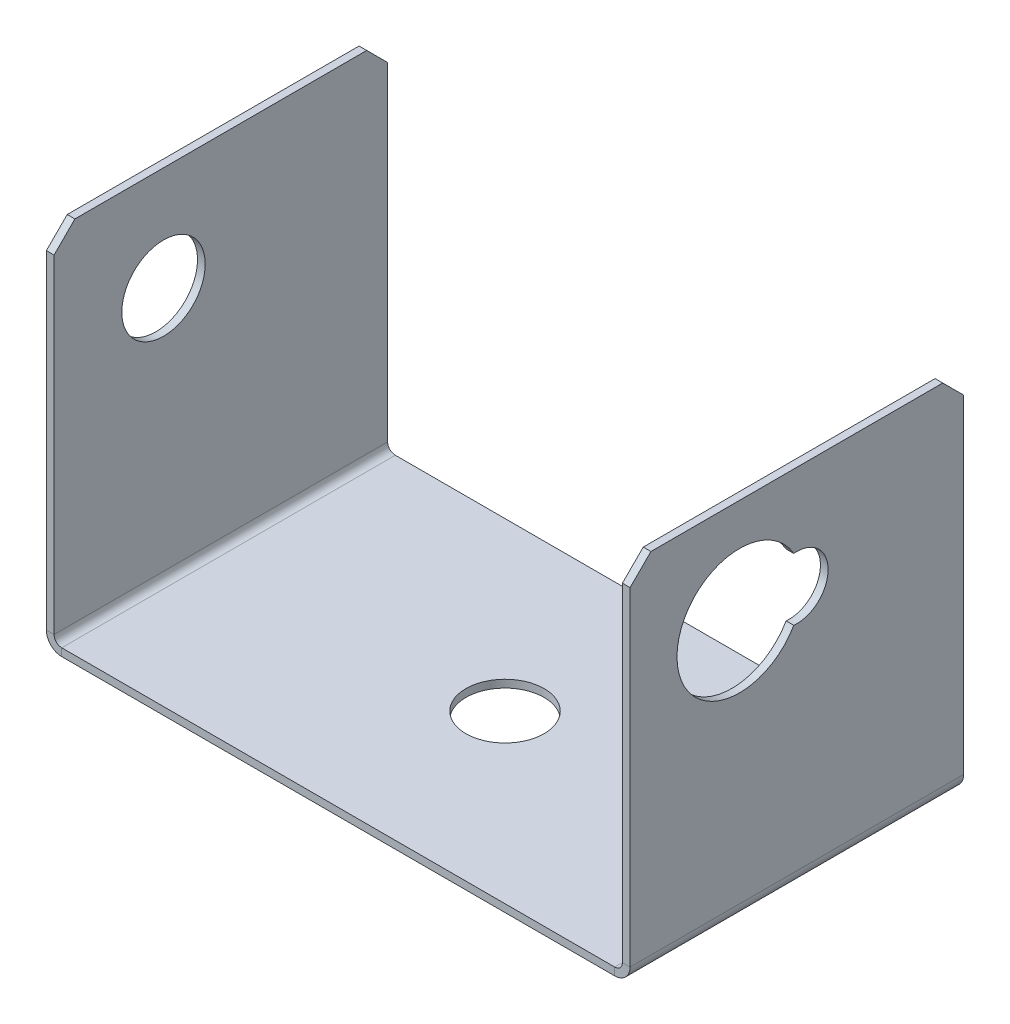
ISO-10303-21;
HEADER;
FILE_DESCRIPTION(('STEP AP214'),'2;1');
FILE_NAME('part.step','',(''),(''),'','','');
FILE_SCHEMA(('AUTOMOTIVE_DESIGN { 1 0 10303 214 1 1 1 1 }'));
ENDSEC;
DATA;
#1=APPLICATION_CONTEXT('core data for automotive mechanical design processes');
#2=APPLICATION_PROTOCOL_DEFINITION('international standard','automotive_design',2000,#1);
#3=PRODUCT_CONTEXT('',#1,'mechanical');
#4=PRODUCT('Part','Part','',(#3));
#5=PRODUCT_RELATED_PRODUCT_CATEGORY('part','',(#4));
#6=PRODUCT_DEFINITION_FORMATION('','',#4);
#7=PRODUCT_DEFINITION_CONTEXT('part definition',#1,'design');
#8=PRODUCT_DEFINITION('design','',#6,#7);
#9=PRODUCT_DEFINITION_SHAPE('','',#8);
#10=(LENGTH_UNIT() NAMED_UNIT(*) SI_UNIT(.MILLI.,.METRE.));
#11=(NAMED_UNIT(*) PLANE_ANGLE_UNIT() SI_UNIT($,.RADIAN.));
#12=(NAMED_UNIT(*) SI_UNIT($,.STERADIAN.) SOLID_ANGLE_UNIT());
#13=UNCERTAINTY_MEASURE_WITH_UNIT(LENGTH_MEASURE(1.E-05),#10,'distance_accuracy_value','');
#14=(GEOMETRIC_REPRESENTATION_CONTEXT(3) GLOBAL_UNCERTAINTY_ASSIGNED_CONTEXT((#13)) GLOBAL_UNIT_ASSIGNED_CONTEXT((#10,
#11,#12)) REPRESENTATION_CONTEXT('',''));
#15=CARTESIAN_POINT('',(0.,0.,0.));
#16=DIRECTION('',(0.,0.,1.));
#17=DIRECTION('',(1.,0.,0.));
#18=AXIS2_PLACEMENT_3D('',#15,#16,#17);
#19=CARTESIAN_POINT('',(0.,1.4732,32.));
#20=DIRECTION('',(0.,0.,1.));
#21=DIRECTION('',(1.,0.,0.));
#22=AXIS2_PLACEMENT_3D('',#19,#20,#21);
#23=PLANE('',#22);
#24=DIRECTION('',(1.,0.,0.));
#25=VECTOR('',#24,1.);
#26=CARTESIAN_POINT('',(0.,1.4732,32.));
#27=LINE('',#26,#25);
#28=CARTESIAN_POINT('',(0.,1.4732,32.));
#29=VERTEX_POINT('',#28);
#30=CARTESIAN_POINT('',(0.7366,1.4732,32.));
#31=VERTEX_POINT('',#30);
#32=EDGE_CURVE('E303',#29,#31,#27,.T.);
#33=ORIENTED_EDGE('',*,*,#32,.F.);
#34=CARTESIAN_POINT('',(1.4732,1.4732,32.));
#35=DIRECTION('',(0.,0.,-1.));
#36=DIRECTION('',(-1.,0.,0.));
#37=AXIS2_PLACEMENT_3D('',#34,#35,#36);
#38=CIRCLE('',#37,1.4732);
#39=CARTESIAN_POINT('',(1.4732,0.,32.));
#40=VERTEX_POINT('',#39);
#41=EDGE_CURVE('E219',#29,#40,#38,.F.);
#42=ORIENTED_EDGE('',*,*,#41,.T.);
#43=DIRECTION('',(0.,-1.,0.));
#44=VECTOR('',#43,1.);
#45=CARTESIAN_POINT('',(1.4732,0.7366,32.));
#46=LINE('',#45,#44);
#47=CARTESIAN_POINT('',(1.4732,0.7366,32.));
#48=VERTEX_POINT('',#47);
#49=EDGE_CURVE('E301',#48,#40,#46,.T.);
#50=ORIENTED_EDGE('',*,*,#49,.F.);
#51=CARTESIAN_POINT('',(1.4732,1.4732,32.));
#52=DIRECTION('',(0.,0.,1.));
#53=DIRECTION('',(1.,0.,0.));
#54=AXIS2_PLACEMENT_3D('',#51,#52,#53);
#55=CIRCLE('',#54,0.7366);
#56=EDGE_CURVE('E212',#31,#48,#55,.T.);
#57=ORIENTED_EDGE('',*,*,#56,.F.);
#58=EDGE_LOOP('',(#33,#42,#50,#57));
#59=FACE_BOUND('',#58,.T.);
#60=ADVANCED_FACE('F45',(#59),#23,.T.);
#61=CARTESIAN_POINT('',(1.4732,0.7366,32.));
#62=DIRECTION('',(0.,0.,1.));
#63=DIRECTION('',(1.,0.,0.));
#64=AXIS2_PLACEMENT_3D('',#61,#62,#63);
#65=PLANE('',#64);
#66=DIRECTION('',(0.,1.,0.));
#67=VECTOR('',#66,1.);
#68=CARTESIAN_POINT('',(0.7366,0.,32.));
#69=LINE('',#68,#67);
#70=CARTESIAN_POINT('',(0.7366,33.,32.));
#71=VERTEX_POINT('',#70);
#72=EDGE_CURVE('E215',#71,#31,#69,.F.);
#73=ORIENTED_EDGE('',*,*,#72,.F.);
#74=DIRECTION('',(-1.,0.,0.));
#75=VECTOR('',#74,1.);
#76=CARTESIAN_POINT('',(1.4732,33.,32.));
#77=LINE('',#76,#75);
#78=CARTESIAN_POINT('',(0.,33.,32.));
#79=VERTEX_POINT('',#78);
#80=EDGE_CURVE('E11',#71,#79,#77,.T.);
#81=ORIENTED_EDGE('',*,*,#80,.T.);
#82=DIRECTION('',(0.,-1.,0.));
#83=VECTOR('',#82,1.);
#84=CARTESIAN_POINT('',(0.,0.,32.));
#85=LINE('',#84,#83);
#86=EDGE_CURVE('E217',#79,#29,#85,.T.);
#87=ORIENTED_EDGE('',*,*,#86,.T.);
#88=ORIENTED_EDGE('',*,*,#32,.T.);
#89=EDGE_LOOP('',(#73,#81,#87,#88));
#90=FACE_BOUND('',#89,.T.);
#91=ADVANCED_FACE('F422',(#90),#65,.T.);
#92=CARTESIAN_POINT('',(1.4732,0.,0.));
#93=DIRECTION('',(0.,0.,-1.));
#94=DIRECTION('',(-1.,0.,0.));
#95=AXIS2_PLACEMENT_3D('',#92,#93,#94);
#96=PLANE('',#95);
#97=DIRECTION('',(0.,1.,0.));
#98=VECTOR('',#97,1.);
#99=CARTESIAN_POINT('',(1.4732,0.,0.));
#100=LINE('',#99,#98);
#101=CARTESIAN_POINT('',(1.4732,0.,0.));
#102=VERTEX_POINT('',#101);
#103=CARTESIAN_POINT('',(1.4732,0.7366,0.));
#104=VERTEX_POINT('',#103);
#105=EDGE_CURVE('E299',#102,#104,#100,.T.);
#106=ORIENTED_EDGE('',*,*,#105,.F.);
#107=CARTESIAN_POINT('',(1.4732,1.4732,0.));
#108=DIRECTION('',(0.,0.,-1.));
#109=DIRECTION('',(-1.,0.,0.));
#110=AXIS2_PLACEMENT_3D('',#107,#108,#109);
#111=CIRCLE('',#110,1.4732);
#112=CARTESIAN_POINT('',(0.,1.4732,0.));
#113=VERTEX_POINT('',#112);
#114=EDGE_CURVE('E247',#113,#102,#111,.F.);
#115=ORIENTED_EDGE('',*,*,#114,.F.);
#116=DIRECTION('',(-1.,0.,0.));
#117=VECTOR('',#116,1.);
#118=CARTESIAN_POINT('',(0.7366,1.4732,0.));
#119=LINE('',#118,#117);
#120=CARTESIAN_POINT('',(0.7366,1.4732,0.));
#121=VERTEX_POINT('',#120);
#122=EDGE_CURVE('E296',#121,#113,#119,.T.);
#123=ORIENTED_EDGE('',*,*,#122,.F.);
#124=CARTESIAN_POINT('',(1.4732,1.4732,0.));
#125=DIRECTION('',(0.,0.,1.));
#126=DIRECTION('',(1.,0.,0.));
#127=AXIS2_PLACEMENT_3D('',#124,#125,#126);
#128=CIRCLE('',#127,0.7366);
#129=EDGE_CURVE('E240',#121,#104,#128,.T.);
#130=ORIENTED_EDGE('',*,*,#129,.T.);
#131=EDGE_LOOP('',(#106,#115,#123,#130));
#132=FACE_BOUND('',#131,.T.);
#133=ADVANCED_FACE('F388',(#132),#96,.T.);
#134=CARTESIAN_POINT('',(0.7366,1.4732,0.));
#135=DIRECTION('',(0.,0.,-1.));
#136=DIRECTION('',(-1.,0.,0.));
#137=AXIS2_PLACEMENT_3D('',#134,#135,#136);
#138=PLANE('',#137);
#139=DIRECTION('',(1.,0.,0.));
#140=VECTOR('',#139,1.);
#141=CARTESIAN_POINT('',(0.,0.,0.));
#142=LINE('',#141,#140);
#143=CARTESIAN_POINT('',(54.5268,0.,0.));
#144=VERTEX_POINT('',#143);
#145=EDGE_CURVE('E250',#102,#144,#142,.T.);
#146=ORIENTED_EDGE('',*,*,#145,.F.);
#147=ORIENTED_EDGE('',*,*,#105,.T.);
#148=DIRECTION('',(1.,0.,0.));
#149=VECTOR('',#148,1.);
#150=CARTESIAN_POINT('',(0.,0.7366,0.));
#151=LINE('',#150,#149);
#152=CARTESIAN_POINT('',(54.5268,0.7366,0.));
#153=VERTEX_POINT('',#152);
#154=EDGE_CURVE('E237',#104,#153,#151,.T.);
#155=ORIENTED_EDGE('',*,*,#154,.T.);
#156=DIRECTION('',(0.,-1.,0.));
#157=VECTOR('',#156,1.);
#158=CARTESIAN_POINT('',(54.5268,0.7366,0.));
#159=LINE('',#158,#157);
#160=EDGE_CURVE('E288',#153,#144,#159,.T.);
#161=ORIENTED_EDGE('',*,*,#160,.T.);
#162=EDGE_LOOP('',(#146,#147,#155,#161));
#163=FACE_BOUND('',#162,.T.);
#164=ADVANCED_FACE('F380',(#163),#138,.T.);
#165=CARTESIAN_POINT('',(54.5268,0.,32.));
#166=DIRECTION('',(0.,0.,1.));
#167=DIRECTION('',(1.,0.,0.));
#168=AXIS2_PLACEMENT_3D('',#165,#166,#167);
#169=PLANE('',#168);
#170=DIRECTION('',(0.,1.,0.));
#171=VECTOR('',#170,1.);
#172=CARTESIAN_POINT('',(54.5268,0.,32.));
#173=LINE('',#172,#171);
#174=CARTESIAN_POINT('',(54.5268,0.,32.));
#175=VERTEX_POINT('',#174);
#176=CARTESIAN_POINT('',(54.5268,0.7366,32.));
#177=VERTEX_POINT('',#176);
#178=EDGE_CURVE('E294',#175,#177,#173,.T.);
#179=ORIENTED_EDGE('',*,*,#178,.F.);
#180=CARTESIAN_POINT('',(54.5268,1.4732,32.));
#181=DIRECTION('',(0.,0.,-1.));
#182=DIRECTION('',(-1.,0.,0.));
#183=AXIS2_PLACEMENT_3D('',#180,#181,#182);
#184=CIRCLE('',#183,1.4732);
#185=CARTESIAN_POINT('',(56.,1.4732,32.));
#186=VERTEX_POINT('',#185);
#187=EDGE_CURVE('E225',#175,#186,#184,.F.);
#188=ORIENTED_EDGE('',*,*,#187,.T.);
#189=DIRECTION('',(1.,0.,0.));
#190=VECTOR('',#189,1.);
#191=CARTESIAN_POINT('',(55.2634,1.4732,32.));
#192=LINE('',#191,#190);
#193=CARTESIAN_POINT('',(55.2634,1.4732,32.));
#194=VERTEX_POINT('',#193);
#195=EDGE_CURVE('E292',#194,#186,#192,.T.);
#196=ORIENTED_EDGE('',*,*,#195,.F.);
#197=CARTESIAN_POINT('',(54.5268,1.4732,32.));
#198=DIRECTION('',(0.,0.,1.));
#199=DIRECTION('',(1.,0.,0.));
#200=AXIS2_PLACEMENT_3D('',#197,#198,#199);
#201=CIRCLE('',#200,0.7366);
#202=EDGE_CURVE('E206',#177,#194,#201,.T.);
#203=ORIENTED_EDGE('',*,*,#202,.F.);
#204=EDGE_LOOP('',(#179,#188,#196,#203));
#205=FACE_BOUND('',#204,.T.);
#206=ADVANCED_FACE('F366',(#205),#169,.T.);
#207=CARTESIAN_POINT('',(55.2634,1.4732,32.));
#208=DIRECTION('',(0.,0.,1.));
#209=DIRECTION('',(1.,0.,0.));
#210=AXIS2_PLACEMENT_3D('',#207,#208,#209);
#211=PLANE('',#210);
#212=DIRECTION('',(1.,0.,0.));
#213=VECTOR('',#212,1.);
#214=CARTESIAN_POINT('',(0.,0.,32.));
#215=LINE('',#214,#213);
#216=EDGE_CURVE('E222',#40,#175,#215,.T.);
#217=ORIENTED_EDGE('',*,*,#216,.T.);
#218=ORIENTED_EDGE('',*,*,#178,.T.);
#219=DIRECTION('',(1.,0.,0.));
#220=VECTOR('',#219,1.);
#221=CARTESIAN_POINT('',(0.,0.7366,32.));
#222=LINE('',#221,#220);
#223=EDGE_CURVE('E209',#48,#177,#222,.T.);
#224=ORIENTED_EDGE('',*,*,#223,.F.);
#225=ORIENTED_EDGE('',*,*,#49,.T.);
#226=EDGE_LOOP('',(#217,#218,#224,#225));
#227=FACE_BOUND('',#226,.T.);
#228=ADVANCED_FACE('F400',(#227),#211,.T.);
#229=CARTESIAN_POINT('',(56.,1.4732,0.));
#230=DIRECTION('',(0.,0.,-1.));
#231=DIRECTION('',(-1.,0.,0.));
#232=AXIS2_PLACEMENT_3D('',#229,#230,#231);
#233=PLANE('',#232);
#234=DIRECTION('',(-1.,0.,0.));
#235=VECTOR('',#234,1.);
#236=CARTESIAN_POINT('',(56.,1.4732,0.));
#237=LINE('',#236,#235);
#238=CARTESIAN_POINT('',(56.,1.4732,0.));
#239=VERTEX_POINT('',#238);
#240=CARTESIAN_POINT('',(55.2634,1.4732,0.));
#241=VERTEX_POINT('',#240);
#242=EDGE_CURVE('E290',#239,#241,#237,.T.);
#243=ORIENTED_EDGE('',*,*,#242,.F.);
#244=CARTESIAN_POINT('',(54.5268,1.4732,0.));
#245=DIRECTION('',(0.,0.,-1.));
#246=DIRECTION('',(-1.,0.,0.));
#247=AXIS2_PLACEMENT_3D('',#244,#245,#246);
#248=CIRCLE('',#247,1.4732);
#249=EDGE_CURVE('E204',#144,#239,#248,.F.);
#250=ORIENTED_EDGE('',*,*,#249,.F.);
#251=ORIENTED_EDGE('',*,*,#160,.F.);
#252=CARTESIAN_POINT('',(54.5268,1.4732,0.));
#253=DIRECTION('',(0.,0.,1.));
#254=DIRECTION('',(1.,0.,0.));
#255=AXIS2_PLACEMENT_3D('',#252,#253,#254);
#256=CIRCLE('',#255,0.7366);
#257=EDGE_CURVE('E234',#153,#241,#256,.T.);
#258=ORIENTED_EDGE('',*,*,#257,.T.);
#259=EDGE_LOOP('',(#243,#250,#251,#258));
#260=FACE_BOUND('',#259,.T.);
#261=ADVANCED_FACE('F372',(#260),#233,.T.);
#262=CARTESIAN_POINT('',(54.5268,0.7366,0.));
#263=DIRECTION('',(0.,0.,-1.));
#264=DIRECTION('',(-1.,0.,0.));
#265=AXIS2_PLACEMENT_3D('',#262,#263,#264);
#266=PLANE('',#265);
#267=DIRECTION('',(0.,1.,0.));
#268=VECTOR('',#267,1.);
#269=CARTESIAN_POINT('',(55.2634,0.,0.));
#270=LINE('',#269,#268);
#271=CARTESIAN_POINT('',(55.2634,33.,0.));
#272=VERTEX_POINT('',#271);
#273=EDGE_CURVE('E231',#241,#272,#270,.T.);
#274=ORIENTED_EDGE('',*,*,#273,.T.);
#275=DIRECTION('',(1.,0.,0.));
#276=VECTOR('',#275,1.);
#277=CARTESIAN_POINT('',(54.5268,33.,0.));
#278=LINE('',#277,#276);
#279=CARTESIAN_POINT('',(56.,33.,0.));
#280=VERTEX_POINT('',#279);
#281=EDGE_CURVE('E329',#272,#280,#278,.T.);
#282=ORIENTED_EDGE('',*,*,#281,.T.);
#283=DIRECTION('',(0.,1.,0.));
#284=VECTOR('',#283,1.);
#285=CARTESIAN_POINT('',(56.,0.,0.));
#286=LINE('',#285,#284);
#287=EDGE_CURVE('E183',#239,#280,#286,.T.);
#288=ORIENTED_EDGE('',*,*,#287,.F.);
#289=ORIENTED_EDGE('',*,*,#242,.T.);
#290=EDGE_LOOP('',(#274,#282,#288,#289));
#291=FACE_BOUND('',#290,.T.);
#292=ADVANCED_FACE('F351',(#291),#266,.T.);
#293=CARTESIAN_POINT('',(56.,0.,32.));
#294=DIRECTION('',(-1.,0.,0.));
#295=DIRECTION('',(0.,0.,1.));
#296=AXIS2_PLACEMENT_3D('',#293,#294,#295);
#297=PLANE('',#296);
#298=CARTESIAN_POINT('',(56.,25.,21.5));
#299=DIRECTION('',(1.,0.,0.));
#300=DIRECTION('',(0.,0.,-1.));
#301=AXIS2_PLACEMENT_3D('',#298,#299,#300);
#302=CIRCLE('',#301,6.);
#303=CARTESIAN_POINT('',(56.,27.985415651391,16.2954545454545));
#304=VERTEX_POINT('',#303);
#305=CARTESIAN_POINT('',(56.,22.014584348609,16.2954545454545));
#306=VERTEX_POINT('',#305);
#307=EDGE_CURVE('E187',#304,#306,#302,.T.);
#308=ORIENTED_EDGE('',*,*,#307,.F.);
#309=CARTESIAN_POINT('',(56.,25.,16.));
#310=DIRECTION('',(1.,0.,0.));
#311=DIRECTION('',(0.,0.,-1.));
#312=AXIS2_PLACEMENT_3D('',#309,#310,#311);
#313=CIRCLE('',#312,3.);
#314=EDGE_CURVE('E177',#306,#304,#313,.T.);
#315=ORIENTED_EDGE('',*,*,#314,.F.);
#316=EDGE_LOOP('',(#308,#315));
#317=FACE_BOUND('',#316,.T.);
#318=ORIENTED_EDGE('',*,*,#287,.T.);
#319=DIRECTION('',(0.,-0.707106781186548,-0.707106781186548));
#320=VECTOR('',#319,1.);
#321=CARTESIAN_POINT('',(56.,33.,0.));
#322=LINE('',#321,#320);
#323=CARTESIAN_POINT('',(56.,35.,2.));
#324=VERTEX_POINT('',#323);
#325=EDGE_CURVE('E334',#280,#324,#322,.F.);
#326=ORIENTED_EDGE('',*,*,#325,.T.);
#327=DIRECTION('',(0.,0.,-1.));
#328=VECTOR('',#327,1.);
#329=CARTESIAN_POINT('',(56.,35.,32.));
#330=LINE('',#329,#328);
#331=CARTESIAN_POINT('',(56.,35.,30.));
#332=VERTEX_POINT('',#331);
#333=EDGE_CURVE('E286',#332,#324,#330,.T.);
#334=ORIENTED_EDGE('',*,*,#333,.F.);
#335=DIRECTION('',(0.,0.707106781186548,-0.707106781186548));
#336=VECTOR('',#335,1.);
#337=CARTESIAN_POINT('',(56.,35.,30.));
#338=LINE('',#337,#336);
#339=CARTESIAN_POINT('',(56.,33.,32.));
#340=VERTEX_POINT('',#339);
#341=EDGE_CURVE('E332',#332,#340,#338,.F.);
#342=ORIENTED_EDGE('',*,*,#341,.T.);
#343=DIRECTION('',(0.,1.,0.));
#344=VECTOR('',#343,1.);
#345=CARTESIAN_POINT('',(56.,0.,32.));
#346=LINE('',#345,#344);
#347=EDGE_CURVE('E201',#186,#340,#346,.T.);
#348=ORIENTED_EDGE('',*,*,#347,.F.);
#349=DIRECTION('',(0.,0.,-1.));
#350=VECTOR('',#349,1.);
#351=CARTESIAN_POINT('',(56.,1.4732,32.));
#352=LINE('',#351,#350);
#353=EDGE_CURVE('E228',#186,#239,#352,.T.);
#354=ORIENTED_EDGE('',*,*,#353,.T.);
#355=EDGE_LOOP('',(#318,#326,#334,#342,#348,#354));
#356=FACE_BOUND('',#355,.T.);
#357=ADVANCED_FACE('F191',(#317,#356),#297,.F.);
#358=CARTESIAN_POINT('',(55.2634,35.,32.));
#359=DIRECTION('',(0.,1.,0.));
#360=DIRECTION('',(0.,0.,1.));
#361=AXIS2_PLACEMENT_3D('',#358,#359,#360);
#362=PLANE('',#361);
#363=ORIENTED_EDGE('',*,*,#333,.T.);
#364=DIRECTION('',(-1.,0.,0.));
#365=VECTOR('',#364,1.);
#366=CARTESIAN_POINT('',(55.2634,35.,2.));
#367=LINE('',#366,#365);
#368=CARTESIAN_POINT('',(55.2634,35.,2.));
#369=VERTEX_POINT('',#368);
#370=EDGE_CURVE('E68',#324,#369,#367,.T.);
#371=ORIENTED_EDGE('',*,*,#370,.T.);
#372=DIRECTION('',(0.,0.,-1.));
#373=VECTOR('',#372,1.);
#374=CARTESIAN_POINT('',(55.2634,35.,32.));
#375=LINE('',#374,#373);
#376=CARTESIAN_POINT('',(55.2634,35.,30.));
#377=VERTEX_POINT('',#376);
#378=EDGE_CURVE('E284',#377,#369,#375,.T.);
#379=ORIENTED_EDGE('',*,*,#378,.F.);
#380=DIRECTION('',(1.,0.,0.));
#381=VECTOR('',#380,1.);
#382=CARTESIAN_POINT('',(55.2634,35.,30.));
#383=LINE('',#382,#381);
#384=EDGE_CURVE('E336',#377,#332,#383,.T.);
#385=ORIENTED_EDGE('',*,*,#384,.T.);
#386=EDGE_LOOP('',(#363,#371,#379,#385));
#387=FACE_BOUND('',#386,.T.);
#388=ADVANCED_FACE('F355',(#387),#362,.T.);
#389=CARTESIAN_POINT('',(55.2634,0.,32.));
#390=DIRECTION('',(-1.,0.,0.));
#391=DIRECTION('',(0.,0.,1.));
#392=AXIS2_PLACEMENT_3D('',#389,#390,#391);
#393=PLANE('',#392);
#394=CARTESIAN_POINT('',(55.2634,25.,16.));
#395=DIRECTION('',(-1.,0.,0.));
#396=DIRECTION('',(0.,0.,1.));
#397=AXIS2_PLACEMENT_3D('',#394,#395,#396);
#398=CIRCLE('',#397,3.);
#399=CARTESIAN_POINT('',(55.2634,27.985415651391,16.2954545454545));
#400=VERTEX_POINT('',#399);
#401=CARTESIAN_POINT('',(55.2634,22.014584348609,16.2954545454545));
#402=VERTEX_POINT('',#401);
#403=EDGE_CURVE('E180',#400,#402,#398,.T.);
#404=ORIENTED_EDGE('',*,*,#403,.F.);
#405=CARTESIAN_POINT('',(55.2634,25.,21.5));
#406=DIRECTION('',(-1.,0.,0.));
#407=DIRECTION('',(0.,0.,1.));
#408=AXIS2_PLACEMENT_3D('',#405,#406,#407);
#409=CIRCLE('',#408,6.);
#410=EDGE_CURVE('E306',#402,#400,#409,.T.);
#411=ORIENTED_EDGE('',*,*,#410,.F.);
#412=EDGE_LOOP('',(#404,#411));
#413=FACE_BOUND('',#412,.T.);
#414=ORIENTED_EDGE('',*,*,#378,.T.);
#415=DIRECTION('',(0.,0.707106781186548,0.707106781186548));
#416=VECTOR('',#415,1.);
#417=CARTESIAN_POINT('',(55.2634,32.5,-0.500000000000007));
#418=LINE('',#417,#416);
#419=EDGE_CURVE('E342',#369,#272,#418,.F.);
#420=ORIENTED_EDGE('',*,*,#419,.T.);
#421=ORIENTED_EDGE('',*,*,#273,.F.);
#422=DIRECTION('',(0.,0.,-1.));
#423=VECTOR('',#422,1.);
#424=CARTESIAN_POINT('',(55.2634,1.4732,32.));
#425=LINE('',#424,#423);
#426=EDGE_CURVE('E281',#194,#241,#425,.T.);
#427=ORIENTED_EDGE('',*,*,#426,.F.);
#428=DIRECTION('',(0.,1.,0.));
#429=VECTOR('',#428,1.);
#430=CARTESIAN_POINT('',(55.2634,0.,32.));
#431=LINE('',#430,#429);
#432=CARTESIAN_POINT('',(55.2634,33.,32.));
#433=VERTEX_POINT('',#432);
#434=EDGE_CURVE('E203',#194,#433,#431,.T.);
#435=ORIENTED_EDGE('',*,*,#434,.T.);
#436=DIRECTION('',(0.,-0.707106781186548,0.707106781186548));
#437=VECTOR('',#436,1.);
#438=CARTESIAN_POINT('',(55.2634,16.5,48.5));
#439=LINE('',#438,#437);
#440=EDGE_CURVE('E340',#433,#377,#439,.F.);
#441=ORIENTED_EDGE('',*,*,#440,.T.);
#442=EDGE_LOOP('',(#414,#420,#421,#427,#435,#441));
#443=FACE_BOUND('',#442,.T.);
#444=ADVANCED_FACE('F346',(#413,#443),#393,.T.);
#445=CARTESIAN_POINT('',(54.5268,1.4732,32.));
#446=DIRECTION('',(0.,0.,-1.));
#447=DIRECTION('',(-1.,0.,0.));
#448=AXIS2_PLACEMENT_3D('',#445,#446,#447);
#449=CYLINDRICAL_SURFACE('',#448,0.7366);
#450=ORIENTED_EDGE('',*,*,#257,.F.);
#451=DIRECTION('',(0.,0.,-1.));
#452=VECTOR('',#451,1.);
#453=CARTESIAN_POINT('',(54.5268,0.7366,32.));
#454=LINE('',#453,#452);
#455=EDGE_CURVE('E278',#177,#153,#454,.T.);
#456=ORIENTED_EDGE('',*,*,#455,.F.);
#457=ORIENTED_EDGE('',*,*,#202,.T.);
#458=ORIENTED_EDGE('',*,*,#426,.T.);
#459=EDGE_LOOP('',(#450,#456,#457,#458));
#460=FACE_BOUND('',#459,.T.);
#461=ADVANCED_FACE('F376',(#460),#449,.F.);
#462=CARTESIAN_POINT('',(0.,0.7366,32.));
#463=DIRECTION('',(0.,1.,0.));
#464=DIRECTION('',(0.,0.,1.));
#465=AXIS2_PLACEMENT_3D('',#462,#463,#464);
#466=PLANE('',#465);
#467=CARTESIAN_POINT('',(28.,0.7366,16.));
#468=DIRECTION('',(0.,1.,0.));
#469=DIRECTION('',(0.,0.,1.));
#470=AXIS2_PLACEMENT_3D('',#467,#468,#469);
#471=CIRCLE('',#470,3.75);
#472=CARTESIAN_POINT('',(28.,0.7366,19.75));
#473=VERTEX_POINT('',#472);
#474=EDGE_CURVE('E313',#473,#473,#471,.T.);
#475=ORIENTED_EDGE('',*,*,#474,.F.);
#476=EDGE_LOOP('',(#475));
#477=FACE_BOUND('',#476,.T.);
#478=ORIENTED_EDGE('',*,*,#154,.F.);
#479=DIRECTION('',(0.,0.,-1.));
#480=VECTOR('',#479,1.);
#481=CARTESIAN_POINT('',(1.4732,0.7366,32.));
#482=LINE('',#481,#480);
#483=EDGE_CURVE('E275',#48,#104,#482,.T.);
#484=ORIENTED_EDGE('',*,*,#483,.F.);
#485=ORIENTED_EDGE('',*,*,#223,.T.);
#486=ORIENTED_EDGE('',*,*,#455,.T.);
#487=EDGE_LOOP('',(#478,#484,#485,#486));
#488=FACE_BOUND('',#487,.T.);
#489=ADVANCED_FACE('F383',(#477,#488),#466,.T.);
#490=CARTESIAN_POINT('',(1.4732,1.4732,32.));
#491=DIRECTION('',(0.,0.,-1.));
#492=DIRECTION('',(-1.,0.,0.));
#493=AXIS2_PLACEMENT_3D('',#490,#491,#492);
#494=CYLINDRICAL_SURFACE('',#493,0.7366);
#495=ORIENTED_EDGE('',*,*,#129,.F.);
#496=DIRECTION('',(0.,0.,-1.));
#497=VECTOR('',#496,1.);
#498=CARTESIAN_POINT('',(0.7366,1.4732,32.));
#499=LINE('',#498,#497);
#500=EDGE_CURVE('E272',#31,#121,#499,.T.);
#501=ORIENTED_EDGE('',*,*,#500,.F.);
#502=ORIENTED_EDGE('',*,*,#56,.T.);
#503=ORIENTED_EDGE('',*,*,#483,.T.);
#504=EDGE_LOOP('',(#495,#501,#502,#503));
#505=FACE_BOUND('',#504,.T.);
#506=ADVANCED_FACE('F392',(#505),#494,.F.);
#507=CARTESIAN_POINT('',(0.7366,0.,32.));
#508=DIRECTION('',(1.,0.,0.));
#509=DIRECTION('',(0.,0.,-1.));
#510=AXIS2_PLACEMENT_3D('',#507,#508,#509);
#511=PLANE('',#510);
#512=CARTESIAN_POINT('',(0.7366,25.,21.5));
#513=DIRECTION('',(1.,0.,0.));
#514=DIRECTION('',(0.,0.,-1.));
#515=AXIS2_PLACEMENT_3D('',#512,#513,#514);
#516=CIRCLE('',#515,4.);
#517=CARTESIAN_POINT('',(0.7366,25.,17.5));
#518=VERTEX_POINT('',#517);
#519=EDGE_CURVE('E193',#518,#518,#516,.T.);
#520=ORIENTED_EDGE('',*,*,#519,.F.);
#521=EDGE_LOOP('',(#520));
#522=FACE_BOUND('',#521,.T.);
#523=DIRECTION('',(0.,1.,0.));
#524=VECTOR('',#523,1.);
#525=CARTESIAN_POINT('',(0.7366,0.,0.));
#526=LINE('',#525,#524);
#527=CARTESIAN_POINT('',(0.7366,33.,0.));
#528=VERTEX_POINT('',#527);
#529=EDGE_CURVE('E243',#528,#121,#526,.F.);
#530=ORIENTED_EDGE('',*,*,#529,.F.);
#531=DIRECTION('',(0.,0.707106781186548,0.707106781186548));
#532=VECTOR('',#531,1.);
#533=CARTESIAN_POINT('',(0.7366,32.5,-0.500000000000007));
#534=LINE('',#533,#532);
#535=CARTESIAN_POINT('',(0.7366,35.,2.));
#536=VERTEX_POINT('',#535);
#537=EDGE_CURVE('E318',#528,#536,#534,.T.);
#538=ORIENTED_EDGE('',*,*,#537,.T.);
#539=DIRECTION('',(0.,0.,-1.));
#540=VECTOR('',#539,1.);
#541=CARTESIAN_POINT('',(0.7366,35.,32.));
#542=LINE('',#541,#540);
#543=CARTESIAN_POINT('',(0.7366,35.,30.));
#544=VERTEX_POINT('',#543);
#545=EDGE_CURVE('E269',#544,#536,#542,.T.);
#546=ORIENTED_EDGE('',*,*,#545,.F.);
#547=DIRECTION('',(0.,0.707106781186548,-0.707106781186548));
#548=VECTOR('',#547,1.);
#549=CARTESIAN_POINT('',(0.7366,16.5,48.5));
#550=LINE('',#549,#548);
#551=EDGE_CURVE('E316',#544,#71,#550,.F.);
#552=ORIENTED_EDGE('',*,*,#551,.T.);
#553=ORIENTED_EDGE('',*,*,#72,.T.);
#554=ORIENTED_EDGE('',*,*,#500,.T.);
#555=EDGE_LOOP('',(#530,#538,#546,#552,#553,#554));
#556=FACE_BOUND('',#555,.T.);
#557=ADVANCED_FACE('F417',(#522,#556),#511,.T.);
#558=CARTESIAN_POINT('',(0.,35.,32.));
#559=DIRECTION('',(0.,1.,0.));
#560=DIRECTION('',(0.,0.,1.));
#561=AXIS2_PLACEMENT_3D('',#558,#559,#560);
#562=PLANE('',#561);
#563=ORIENTED_EDGE('',*,*,#545,.T.);
#564=DIRECTION('',(-1.,0.,0.));
#565=VECTOR('',#564,1.);
#566=CARTESIAN_POINT('',(0.,35.,2.));
#567=LINE('',#566,#565);
#568=CARTESIAN_POINT('',(0.,35.,2.));
#569=VERTEX_POINT('',#568);
#570=EDGE_CURVE('E323',#536,#569,#567,.T.);
#571=ORIENTED_EDGE('',*,*,#570,.T.);
#572=DIRECTION('',(0.,0.,-1.));
#573=VECTOR('',#572,1.);
#574=CARTESIAN_POINT('',(0.,35.,32.));
#575=LINE('',#574,#573);
#576=CARTESIAN_POINT('',(0.,35.,30.));
#577=VERTEX_POINT('',#576);
#578=EDGE_CURVE('E266',#577,#569,#575,.T.);
#579=ORIENTED_EDGE('',*,*,#578,.F.);
#580=DIRECTION('',(1.,0.,0.));
#581=VECTOR('',#580,1.);
#582=CARTESIAN_POINT('',(0.,35.,30.));
#583=LINE('',#582,#581);
#584=EDGE_CURVE('E320',#577,#544,#583,.T.);
#585=ORIENTED_EDGE('',*,*,#584,.T.);
#586=EDGE_LOOP('',(#563,#571,#579,#585));
#587=FACE_BOUND('',#586,.T.);
#588=ADVANCED_FACE('F427',(#587),#562,.T.);
#589=CARTESIAN_POINT('',(0.,0.,32.));
#590=DIRECTION('',(1.,0.,0.));
#591=DIRECTION('',(0.,0.,-1.));
#592=AXIS2_PLACEMENT_3D('',#589,#590,#591);
#593=PLANE('',#592);
#594=CARTESIAN_POINT('',(0.,25.,21.5));
#595=DIRECTION('',(-1.,0.,0.));
#596=DIRECTION('',(0.,0.,1.));
#597=AXIS2_PLACEMENT_3D('',#594,#595,#596);
#598=CIRCLE('',#597,4.);
#599=CARTESIAN_POINT('',(0.,25.,25.5));
#600=VERTEX_POINT('',#599);
#601=EDGE_CURVE('E196',#600,#600,#598,.T.);
#602=ORIENTED_EDGE('',*,*,#601,.F.);
#603=EDGE_LOOP('',(#602));
#604=FACE_BOUND('',#603,.T.);
#605=ORIENTED_EDGE('',*,*,#578,.T.);
#606=DIRECTION('',(0.,-0.707106781186548,-0.707106781186548));
#607=VECTOR('',#606,1.);
#608=CARTESIAN_POINT('',(0.,33.,0.));
#609=LINE('',#608,#607);
#610=CARTESIAN_POINT('',(0.,33.,0.));
#611=VERTEX_POINT('',#610);
#612=EDGE_CURVE('E327',#569,#611,#609,.T.);
#613=ORIENTED_EDGE('',*,*,#612,.T.);
#614=DIRECTION('',(0.,-1.,0.));
#615=VECTOR('',#614,1.);
#616=CARTESIAN_POINT('',(0.,0.,0.));
#617=LINE('',#616,#615);
#618=EDGE_CURVE('E245',#611,#113,#617,.T.);
#619=ORIENTED_EDGE('',*,*,#618,.T.);
#620=DIRECTION('',(0.,0.,-1.));
#621=VECTOR('',#620,1.);
#622=CARTESIAN_POINT('',(0.,1.4732,32.));
#623=LINE('',#622,#621);
#624=EDGE_CURVE('E263',#29,#113,#623,.T.);
#625=ORIENTED_EDGE('',*,*,#624,.F.);
#626=ORIENTED_EDGE('',*,*,#86,.F.);
#627=DIRECTION('',(0.,-0.707106781186548,0.707106781186548));
#628=VECTOR('',#627,1.);
#629=CARTESIAN_POINT('',(0.,35.,30.));
#630=LINE('',#629,#628);
#631=EDGE_CURVE('E325',#79,#577,#630,.F.);
#632=ORIENTED_EDGE('',*,*,#631,.T.);
#633=EDGE_LOOP('',(#605,#613,#619,#625,#626,#632));
#634=FACE_BOUND('',#633,.T.);
#635=ADVANCED_FACE('F408',(#604,#634),#593,.F.);
#636=CARTESIAN_POINT('',(1.4732,1.4732,32.));
#637=DIRECTION('',(0.,0.,-1.));
#638=DIRECTION('',(-1.,0.,0.));
#639=AXIS2_PLACEMENT_3D('',#636,#637,#638);
#640=CYLINDRICAL_SURFACE('',#639,1.4732);
#641=ORIENTED_EDGE('',*,*,#114,.T.);
#642=DIRECTION('',(0.,0.,-1.));
#643=VECTOR('',#642,1.);
#644=CARTESIAN_POINT('',(1.4732,0.,32.));
#645=LINE('',#644,#643);
#646=EDGE_CURVE('E260',#40,#102,#645,.T.);
#647=ORIENTED_EDGE('',*,*,#646,.F.);
#648=ORIENTED_EDGE('',*,*,#41,.F.);
#649=ORIENTED_EDGE('',*,*,#624,.T.);
#650=EDGE_LOOP('',(#641,#647,#648,#649));
#651=FACE_BOUND('',#650,.T.);
#652=ADVANCED_FACE('F405',(#651),#640,.T.);
#653=CARTESIAN_POINT('',(0.,0.,32.));
#654=DIRECTION('',(0.,1.,0.));
#655=DIRECTION('',(0.,0.,1.));
#656=AXIS2_PLACEMENT_3D('',#653,#654,#655);
#657=PLANE('',#656);
#658=CARTESIAN_POINT('',(28.,0.,16.));
#659=DIRECTION('',(0.,1.,0.));
#660=DIRECTION('',(0.,0.,1.));
#661=AXIS2_PLACEMENT_3D('',#658,#659,#660);
#662=CIRCLE('',#661,3.75);
#663=CARTESIAN_POINT('',(28.,0.,19.75));
#664=VERTEX_POINT('',#663);
#665=EDGE_CURVE('E310',#664,#664,#662,.T.);
#666=ORIENTED_EDGE('',*,*,#665,.T.);
#667=EDGE_LOOP('',(#666));
#668=FACE_BOUND('',#667,.T.);
#669=ORIENTED_EDGE('',*,*,#145,.T.);
#670=DIRECTION('',(0.,0.,-1.));
#671=VECTOR('',#670,1.);
#672=CARTESIAN_POINT('',(54.5268,0.,32.));
#673=LINE('',#672,#671);
#674=EDGE_CURVE('E257',#175,#144,#673,.T.);
#675=ORIENTED_EDGE('',*,*,#674,.F.);
#676=ORIENTED_EDGE('',*,*,#216,.F.);
#677=ORIENTED_EDGE('',*,*,#646,.T.);
#678=EDGE_LOOP('',(#669,#675,#676,#677));
#679=FACE_BOUND('',#678,.T.);
#680=ADVANCED_FACE('F403',(#668,#679),#657,.F.);
#681=CARTESIAN_POINT('',(54.5268,1.4732,32.));
#682=DIRECTION('',(0.,0.,-1.));
#683=DIRECTION('',(-1.,0.,0.));
#684=AXIS2_PLACEMENT_3D('',#681,#682,#683);
#685=CYLINDRICAL_SURFACE('',#684,1.4732);
#686=ORIENTED_EDGE('',*,*,#249,.T.);
#687=ORIENTED_EDGE('',*,*,#353,.F.);
#688=ORIENTED_EDGE('',*,*,#187,.F.);
#689=ORIENTED_EDGE('',*,*,#674,.T.);
#690=EDGE_LOOP('',(#686,#687,#688,#689));
#691=FACE_BOUND('',#690,.T.);
#692=ADVANCED_FACE('F368',(#691),#685,.T.);
#693=CARTESIAN_POINT('',(54.5268,1.4732,32.));
#694=DIRECTION('',(0.,0.,1.));
#695=DIRECTION('',(1.,0.,0.));
#696=AXIS2_PLACEMENT_3D('',#693,#694,#695);
#697=PLANE('',#696);
#698=ORIENTED_EDGE('',*,*,#347,.T.);
#699=DIRECTION('',(-1.,0.,0.));
#700=VECTOR('',#699,1.);
#701=CARTESIAN_POINT('',(54.5268,33.,32.));
#702=LINE('',#701,#700);
#703=EDGE_CURVE('E54',#340,#433,#702,.T.);
#704=ORIENTED_EDGE('',*,*,#703,.T.);
#705=ORIENTED_EDGE('',*,*,#434,.F.);
#706=ORIENTED_EDGE('',*,*,#195,.T.);
#707=EDGE_LOOP('',(#698,#704,#705,#706));
#708=FACE_BOUND('',#707,.T.);
#709=ADVANCED_FACE('F361',(#708),#697,.T.);
#710=CARTESIAN_POINT('',(54.5268,1.4732,0.));
#711=DIRECTION('',(0.,0.,1.));
#712=DIRECTION('',(1.,0.,0.));
#713=AXIS2_PLACEMENT_3D('',#710,#711,#712);
#714=PLANE('',#713);
#715=ORIENTED_EDGE('',*,*,#618,.F.);
#716=DIRECTION('',(1.,0.,0.));
#717=VECTOR('',#716,1.);
#718=CARTESIAN_POINT('',(0.7366,33.,0.));
#719=LINE('',#718,#717);
#720=EDGE_CURVE('E309',#611,#528,#719,.T.);
#721=ORIENTED_EDGE('',*,*,#720,.T.);
#722=ORIENTED_EDGE('',*,*,#529,.T.);
#723=ORIENTED_EDGE('',*,*,#122,.T.);
#724=EDGE_LOOP('',(#715,#721,#722,#723));
#725=FACE_BOUND('',#724,.T.);
#726=ADVANCED_FACE('F414',(#725),#714,.F.);
#727=CARTESIAN_POINT('',(46.,25.,16.));
#728=DIRECTION('',(1.,0.,0.));
#729=DIRECTION('',(0.,0.,-1.));
#730=AXIS2_PLACEMENT_3D('',#727,#728,#729);
#731=CYLINDRICAL_SURFACE('',#730,3.);
#732=ORIENTED_EDGE('',*,*,#403,.T.);
#733=DIRECTION('',(1.,0.,0.));
#734=VECTOR('',#733,1.);
#735=CARTESIAN_POINT('',(46.,22.014584348609,16.2954545454545));
#736=LINE('',#735,#734);
#737=EDGE_CURVE('E172',#402,#306,#736,.T.);
#738=ORIENTED_EDGE('',*,*,#737,.T.);
#739=ORIENTED_EDGE('',*,*,#314,.T.);
#740=DIRECTION('',(1.,0.,0.));
#741=VECTOR('',#740,1.);
#742=CARTESIAN_POINT('',(46.,27.985415651391,16.2954545454545));
#743=LINE('',#742,#741);
#744=EDGE_CURVE('E184',#400,#304,#743,.T.);
#745=ORIENTED_EDGE('',*,*,#744,.F.);
#746=EDGE_LOOP('',(#732,#738,#739,#745));
#747=FACE_BOUND('',#746,.T.);
#748=ADVANCED_FACE('F174',(#747),#731,.F.);
#749=CARTESIAN_POINT('',(46.,25.,21.5));
#750=DIRECTION('',(1.,0.,0.));
#751=DIRECTION('',(0.,0.,-1.));
#752=AXIS2_PLACEMENT_3D('',#749,#750,#751);
#753=CYLINDRICAL_SURFACE('',#752,6.);
#754=ORIENTED_EDGE('',*,*,#410,.T.);
#755=ORIENTED_EDGE('',*,*,#744,.T.);
#756=ORIENTED_EDGE('',*,*,#307,.T.);
#757=ORIENTED_EDGE('',*,*,#737,.F.);
#758=EDGE_LOOP('',(#754,#755,#756,#757));
#759=FACE_BOUND('',#758,.T.);
#760=ADVANCED_FACE('F188',(#759),#753,.F.);
#761=CARTESIAN_POINT('',(10.,25.,21.5));
#762=DIRECTION('',(-1.,0.,0.));
#763=DIRECTION('',(0.,0.,1.));
#764=AXIS2_PLACEMENT_3D('',#761,#762,#763);
#765=CYLINDRICAL_SURFACE('',#764,4.);
#766=ORIENTED_EDGE('',*,*,#519,.T.);
#767=EDGE_LOOP('',(#766));
#768=FACE_BOUND('',#767,.T.);
#769=ORIENTED_EDGE('',*,*,#601,.T.);
#770=EDGE_LOOP('',(#769));
#771=FACE_BOUND('',#770,.T.);
#772=ADVANCED_FACE('F440',(#768,#771),#765,.F.);
#773=CARTESIAN_POINT('',(28.,-9.2634,16.));
#774=DIRECTION('',(0.,1.,0.));
#775=DIRECTION('',(0.,0.,1.));
#776=AXIS2_PLACEMENT_3D('',#773,#774,#775);
#777=CYLINDRICAL_SURFACE('',#776,3.75);
#778=ORIENTED_EDGE('',*,*,#474,.T.);
#779=EDGE_LOOP('',(#778));
#780=FACE_BOUND('',#779,.T.);
#781=ORIENTED_EDGE('',*,*,#665,.F.);
#782=EDGE_LOOP('',(#781));
#783=FACE_BOUND('',#782,.T.);
#784=ADVANCED_FACE('F432',(#780,#783),#777,.F.);
#785=CARTESIAN_POINT('',(54.5268,33.,0.));
#786=DIRECTION('',(0.,0.707106781186547,-0.707106781186547));
#787=DIRECTION('',(-1.,0.,0.));
#788=AXIS2_PLACEMENT_3D('',#785,#786,#787);
#789=PLANE('',#788);
#790=ORIENTED_EDGE('',*,*,#612,.F.);
#791=ORIENTED_EDGE('',*,*,#570,.F.);
#792=ORIENTED_EDGE('',*,*,#537,.F.);
#793=ORIENTED_EDGE('',*,*,#720,.F.);
#794=EDGE_LOOP('',(#790,#791,#792,#793));
#795=FACE_BOUND('',#794,.T.);
#796=ADVANCED_FACE('F430',(#795),#789,.T.);
#797=CARTESIAN_POINT('',(54.5268,33.,0.));
#798=DIRECTION('',(0.,-0.707106781186547,0.707106781186547));
#799=DIRECTION('',(1.,0.,0.));
#800=AXIS2_PLACEMENT_3D('',#797,#798,#799);
#801=PLANE('',#800);
#802=ORIENTED_EDGE('',*,*,#419,.F.);
#803=ORIENTED_EDGE('',*,*,#370,.F.);
#804=ORIENTED_EDGE('',*,*,#325,.F.);
#805=ORIENTED_EDGE('',*,*,#281,.F.);
#806=EDGE_LOOP('',(#802,#803,#804,#805));
#807=FACE_BOUND('',#806,.T.);
#808=ADVANCED_FACE('F353',(#807),#801,.F.);
#809=CARTESIAN_POINT('',(55.2634,35.,30.));
#810=DIRECTION('',(0.,-0.707106781186547,-0.707106781186547));
#811=DIRECTION('',(1.,0.,0.));
#812=AXIS2_PLACEMENT_3D('',#809,#810,#811);
#813=PLANE('',#812);
#814=ORIENTED_EDGE('',*,*,#440,.F.);
#815=ORIENTED_EDGE('',*,*,#703,.F.);
#816=ORIENTED_EDGE('',*,*,#341,.F.);
#817=ORIENTED_EDGE('',*,*,#384,.F.);
#818=EDGE_LOOP('',(#814,#815,#816,#817));
#819=FACE_BOUND('',#818,.T.);
#820=ADVANCED_FACE('F359',(#819),#813,.F.);
#821=CARTESIAN_POINT('',(0.,35.,30.));
#822=DIRECTION('',(0.,-0.707106781186547,-0.707106781186547));
#823=DIRECTION('',(1.,0.,0.));
#824=AXIS2_PLACEMENT_3D('',#821,#822,#823);
#825=PLANE('',#824);
#826=ORIENTED_EDGE('',*,*,#631,.F.);
#827=ORIENTED_EDGE('',*,*,#80,.F.);
#828=ORIENTED_EDGE('',*,*,#551,.F.);
#829=ORIENTED_EDGE('',*,*,#584,.F.);
#830=EDGE_LOOP('',(#826,#827,#828,#829));
#831=FACE_BOUND('',#830,.T.);
#832=ADVANCED_FACE('F48',(#831),#825,.F.);
#833=CLOSED_SHELL('',(#60,#91,#133,#164,#206,#228,#261,#292,#357,#388,#444,#461,#489,#506,#557,
#588,#635,#652,#680,#692,#709,#726,#748,#760,#772,#784,#796,#808,#820,#832));
#834=MANIFOLD_SOLID_BREP('B2',#833);
#835=ADVANCED_BREP_SHAPE_REPRESENTATION('',(#18,#834),#14);
#836=SHAPE_DEFINITION_REPRESENTATION(#9,#835);
ENDSEC;
END-ISO-10303-21;
